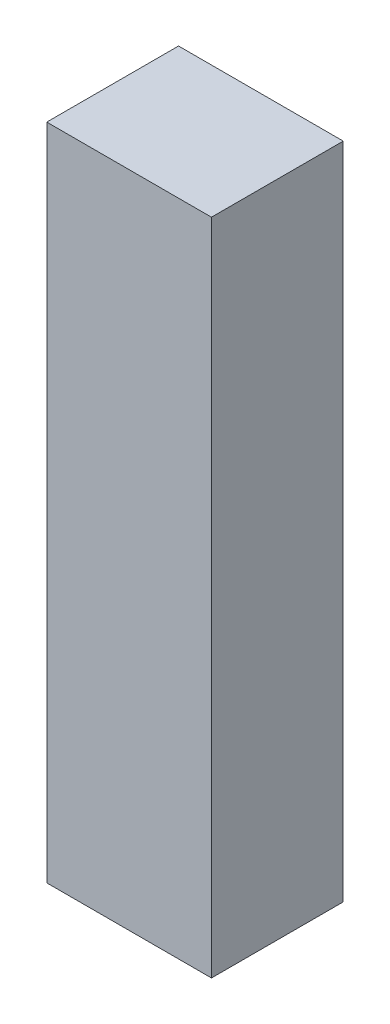
ISO-10303-21;
HEADER;
FILE_DESCRIPTION(('STEP AP214'),'2;1');
FILE_NAME('part.step','',(''),(''),'','','');
FILE_SCHEMA(('AUTOMOTIVE_DESIGN { 1 0 10303 214 1 1 1 1 }'));
ENDSEC;
DATA;
#1=APPLICATION_CONTEXT('core data for automotive mechanical design processes');
#2=APPLICATION_PROTOCOL_DEFINITION('international standard','automotive_design',2000,#1);
#3=PRODUCT_CONTEXT('',#1,'mechanical');
#4=PRODUCT('Part','Part','',(#3));
#5=PRODUCT_RELATED_PRODUCT_CATEGORY('part','',(#4));
#6=PRODUCT_DEFINITION_FORMATION('','',#4);
#7=PRODUCT_DEFINITION_CONTEXT('part definition',#1,'design');
#8=PRODUCT_DEFINITION('design','',#6,#7);
#9=PRODUCT_DEFINITION_SHAPE('','',#8);
#10=(LENGTH_UNIT() NAMED_UNIT(*) SI_UNIT(.MILLI.,.METRE.));
#11=(NAMED_UNIT(*) PLANE_ANGLE_UNIT() SI_UNIT($,.RADIAN.));
#12=(NAMED_UNIT(*) SI_UNIT($,.STERADIAN.) SOLID_ANGLE_UNIT());
#13=UNCERTAINTY_MEASURE_WITH_UNIT(LENGTH_MEASURE(1.E-05),#10,'distance_accuracy_value','');
#14=(GEOMETRIC_REPRESENTATION_CONTEXT(3) GLOBAL_UNCERTAINTY_ASSIGNED_CONTEXT((#13)) GLOBAL_UNIT_ASSIGNED_CONTEXT((#10,
#11,#12)) REPRESENTATION_CONTEXT('',''));
#15=CARTESIAN_POINT('',(0.,0.,0.));
#16=DIRECTION('',(0.,0.,1.));
#17=DIRECTION('',(1.,0.,0.));
#18=AXIS2_PLACEMENT_3D('',#15,#16,#17);
#19=CARTESIAN_POINT('',(440.,330.,-776.));
#20=DIRECTION('',(-1.,0.,0.));
#21=DIRECTION('',(0.,0.,1.));
#22=AXIS2_PLACEMENT_3D('',#19,#20,#21);
#23=PLANE('',#22);
#24=DIRECTION('',(0.,-1.,0.));
#25=VECTOR('',#24,1.);
#26=CARTESIAN_POINT('',(440.,330.,-736.));
#27=LINE('',#26,#25);
#28=CARTESIAN_POINT('',(440.,530.,-736.));
#29=VERTEX_POINT('',#28);
#30=CARTESIAN_POINT('',(440.,330.,-736.));
#31=VERTEX_POINT('',#30);
#32=EDGE_CURVE('E103',#29,#31,#27,.T.);
#33=ORIENTED_EDGE('',*,*,#32,.F.);
#34=DIRECTION('',(0.,0.,1.));
#35=VECTOR('',#34,1.);
#36=CARTESIAN_POINT('',(440.,530.,-776.));
#37=LINE('',#36,#35);
#38=CARTESIAN_POINT('',(440.,530.,-776.));
#39=VERTEX_POINT('',#38);
#40=EDGE_CURVE('E11',#39,#29,#37,.T.);
#41=ORIENTED_EDGE('',*,*,#40,.F.);
#42=DIRECTION('',(0.,-1.,0.));
#43=VECTOR('',#42,1.);
#44=CARTESIAN_POINT('',(440.,330.,-776.));
#45=LINE('',#44,#43);
#46=CARTESIAN_POINT('',(440.,330.,-776.));
#47=VERTEX_POINT('',#46);
#48=EDGE_CURVE('E97',#39,#47,#45,.T.);
#49=ORIENTED_EDGE('',*,*,#48,.T.);
#50=DIRECTION('',(0.,0.,1.));
#51=VECTOR('',#50,1.);
#52=CARTESIAN_POINT('',(440.,330.,-776.));
#53=LINE('',#52,#51);
#54=EDGE_CURVE('E42',#47,#31,#53,.T.);
#55=ORIENTED_EDGE('',*,*,#54,.T.);
#56=EDGE_LOOP('',(#33,#41,#49,#55));
#57=FACE_BOUND('',#56,.T.);
#58=ADVANCED_FACE('F39',(#57),#23,.T.);
#59=CARTESIAN_POINT('',(440.,530.,-776.));
#60=DIRECTION('',(0.,1.,0.));
#61=DIRECTION('',(0.,0.,1.));
#62=AXIS2_PLACEMENT_3D('',#59,#60,#61);
#63=PLANE('',#62);
#64=DIRECTION('',(-1.,0.,0.));
#65=VECTOR('',#64,1.);
#66=CARTESIAN_POINT('',(440.,530.,-736.));
#67=LINE('',#66,#65);
#68=CARTESIAN_POINT('',(490.,530.,-736.));
#69=VERTEX_POINT('',#68);
#70=EDGE_CURVE('E99',#69,#29,#67,.T.);
#71=ORIENTED_EDGE('',*,*,#70,.F.);
#72=DIRECTION('',(0.,0.,1.));
#73=VECTOR('',#72,1.);
#74=CARTESIAN_POINT('',(490.,530.,-776.));
#75=LINE('',#74,#73);
#76=CARTESIAN_POINT('',(490.,530.,-776.));
#77=VERTEX_POINT('',#76);
#78=EDGE_CURVE('E48',#77,#69,#75,.T.);
#79=ORIENTED_EDGE('',*,*,#78,.F.);
#80=DIRECTION('',(-1.,0.,0.));
#81=VECTOR('',#80,1.);
#82=CARTESIAN_POINT('',(440.,530.,-776.));
#83=LINE('',#82,#81);
#84=EDGE_CURVE('E94',#77,#39,#83,.T.);
#85=ORIENTED_EDGE('',*,*,#84,.T.);
#86=ORIENTED_EDGE('',*,*,#40,.T.);
#87=EDGE_LOOP('',(#71,#79,#85,#86));
#88=FACE_BOUND('',#87,.T.);
#89=ADVANCED_FACE('F113',(#88),#63,.T.);
#90=CARTESIAN_POINT('',(490.,330.,-776.));
#91=DIRECTION('',(1.,0.,0.));
#92=DIRECTION('',(0.,0.,-1.));
#93=AXIS2_PLACEMENT_3D('',#90,#91,#92);
#94=PLANE('',#93);
#95=DIRECTION('',(0.,1.,0.));
#96=VECTOR('',#95,1.);
#97=CARTESIAN_POINT('',(490.,330.,-736.));
#98=LINE('',#97,#96);
#99=CARTESIAN_POINT('',(490.,330.,-736.));
#100=VERTEX_POINT('',#99);
#101=EDGE_CURVE('E89',#100,#69,#98,.T.);
#102=ORIENTED_EDGE('',*,*,#101,.F.);
#103=DIRECTION('',(0.,0.,1.));
#104=VECTOR('',#103,1.);
#105=CARTESIAN_POINT('',(490.,330.,-776.));
#106=LINE('',#105,#104);
#107=CARTESIAN_POINT('',(490.,330.,-776.));
#108=VERTEX_POINT('',#107);
#109=EDGE_CURVE('E84',#108,#100,#106,.T.);
#110=ORIENTED_EDGE('',*,*,#109,.F.);
#111=DIRECTION('',(0.,1.,0.));
#112=VECTOR('',#111,1.);
#113=CARTESIAN_POINT('',(490.,330.,-776.));
#114=LINE('',#113,#112);
#115=EDGE_CURVE('E87',#108,#77,#114,.T.);
#116=ORIENTED_EDGE('',*,*,#115,.T.);
#117=ORIENTED_EDGE('',*,*,#78,.T.);
#118=EDGE_LOOP('',(#102,#110,#116,#117));
#119=FACE_BOUND('',#118,.T.);
#120=ADVANCED_FACE('F86',(#119),#94,.T.);
#121=CARTESIAN_POINT('',(440.,330.,-776.));
#122=DIRECTION('',(0.,-1.,0.));
#123=DIRECTION('',(0.,0.,-1.));
#124=AXIS2_PLACEMENT_3D('',#121,#122,#123);
#125=PLANE('',#124);
#126=DIRECTION('',(1.,0.,0.));
#127=VECTOR('',#126,1.);
#128=CARTESIAN_POINT('',(440.,330.,-736.));
#129=LINE('',#128,#127);
#130=EDGE_CURVE('E106',#31,#100,#129,.T.);
#131=ORIENTED_EDGE('',*,*,#130,.F.);
#132=ORIENTED_EDGE('',*,*,#54,.F.);
#133=DIRECTION('',(1.,0.,0.));
#134=VECTOR('',#133,1.);
#135=CARTESIAN_POINT('',(440.,330.,-776.));
#136=LINE('',#135,#134);
#137=EDGE_CURVE('E93',#47,#108,#136,.T.);
#138=ORIENTED_EDGE('',*,*,#137,.T.);
#139=ORIENTED_EDGE('',*,*,#109,.T.);
#140=EDGE_LOOP('',(#131,#132,#138,#139));
#141=FACE_BOUND('',#140,.T.);
#142=ADVANCED_FACE('F96',(#141),#125,.T.);
#143=CARTESIAN_POINT('',(0.,0.,-776.));
#144=DIRECTION('',(0.,0.,-1.));
#145=DIRECTION('',(-1.,0.,0.));
#146=AXIS2_PLACEMENT_3D('',#143,#144,#145);
#147=PLANE('',#146);
#148=ORIENTED_EDGE('',*,*,#48,.F.);
#149=ORIENTED_EDGE('',*,*,#84,.F.);
#150=ORIENTED_EDGE('',*,*,#115,.F.);
#151=ORIENTED_EDGE('',*,*,#137,.F.);
#152=EDGE_LOOP('',(#148,#149,#150,#151));
#153=FACE_BOUND('',#152,.T.);
#154=ADVANCED_FACE('F92',(#153),#147,.T.);
#155=CARTESIAN_POINT('',(0.,0.,-736.));
#156=DIRECTION('',(0.,0.,-1.));
#157=DIRECTION('',(-1.,0.,0.));
#158=AXIS2_PLACEMENT_3D('',#155,#156,#157);
#159=PLANE('',#158);
#160=ORIENTED_EDGE('',*,*,#32,.T.);
#161=ORIENTED_EDGE('',*,*,#130,.T.);
#162=ORIENTED_EDGE('',*,*,#101,.T.);
#163=ORIENTED_EDGE('',*,*,#70,.T.);
#164=EDGE_LOOP('',(#160,#161,#162,#163));
#165=FACE_BOUND('',#164,.T.);
#166=ADVANCED_FACE('F112',(#165),#159,.F.);
#167=CLOSED_SHELL('',(#58,#89,#120,#142,#154,#166));
#168=MANIFOLD_SOLID_BREP('B2',#167);
#169=ADVANCED_BREP_SHAPE_REPRESENTATION('',(#18,#168),#14);
#170=SHAPE_DEFINITION_REPRESENTATION(#9,#169);
ENDSEC;
END-ISO-10303-21;
